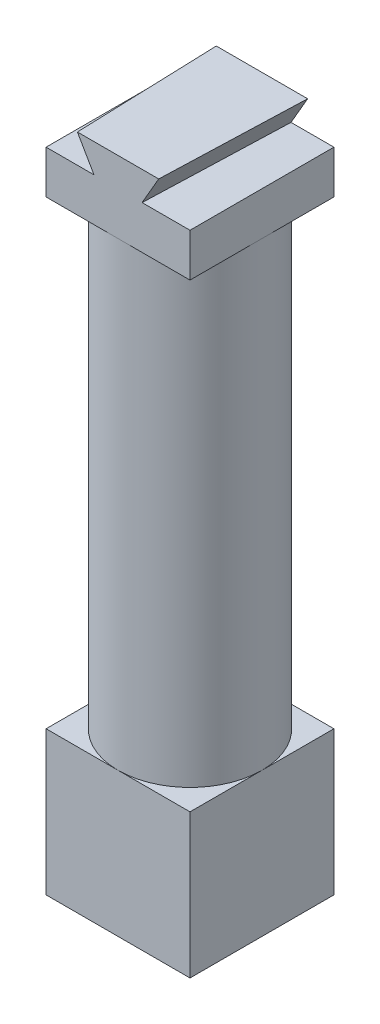
ISO-10303-21;
HEADER;
FILE_DESCRIPTION(('STEP AP214'),'2;1');
FILE_NAME('part.step','',(''),(''),'','','');
FILE_SCHEMA(('AUTOMOTIVE_DESIGN { 1 0 10303 214 1 1 1 1 }'));
ENDSEC;
DATA;
#1=APPLICATION_CONTEXT('core data for automotive mechanical design processes');
#2=APPLICATION_PROTOCOL_DEFINITION('international standard','automotive_design',2000,#1);
#3=PRODUCT_CONTEXT('',#1,'mechanical');
#4=PRODUCT('Part','Part','',(#3));
#5=PRODUCT_RELATED_PRODUCT_CATEGORY('part','',(#4));
#6=PRODUCT_DEFINITION_FORMATION('','',#4);
#7=PRODUCT_DEFINITION_CONTEXT('part definition',#1,'design');
#8=PRODUCT_DEFINITION('design','',#6,#7);
#9=PRODUCT_DEFINITION_SHAPE('','',#8);
#10=(LENGTH_UNIT() NAMED_UNIT(*) SI_UNIT(.MILLI.,.METRE.));
#11=(NAMED_UNIT(*) PLANE_ANGLE_UNIT() SI_UNIT($,.RADIAN.));
#12=(NAMED_UNIT(*) SI_UNIT($,.STERADIAN.) SOLID_ANGLE_UNIT());
#13=UNCERTAINTY_MEASURE_WITH_UNIT(LENGTH_MEASURE(1.E-05),#10,'distance_accuracy_value','');
#14=(GEOMETRIC_REPRESENTATION_CONTEXT(3) GLOBAL_UNCERTAINTY_ASSIGNED_CONTEXT((#13)) GLOBAL_UNIT_ASSIGNED_CONTEXT((#10,
#11,#12)) REPRESENTATION_CONTEXT('',''));
#15=CARTESIAN_POINT('',(0.,0.,0.));
#16=DIRECTION('',(0.,0.,1.));
#17=DIRECTION('',(1.,0.,0.));
#18=AXIS2_PLACEMENT_3D('',#15,#16,#17);
#19=CARTESIAN_POINT('',(3.20659618536911,-1.58749948953486,-7.9375));
#20=DIRECTION('',(0.,-1.,-2.4428830166427E-08));
#21=DIRECTION('',(0.,2.4428830166427E-08,-1.));
#22=AXIS2_PLACEMENT_3D('',#19,#20,#21);
#23=PLANE('',#22);
#24=DIRECTION('',(-0.0348995366665107,-2.44139487274035E-08,0.999390825623521));
#25=VECTOR('',#24,1.);
#26=CARTESIAN_POINT('',(3.20659618536911,-1.58749948953486,-7.9375));
#27=LINE('',#26,#25);
#28=CARTESIAN_POINT('',(3.20659618536911,-1.58749948953486,-7.9375));
#29=VERTEX_POINT('',#28);
#30=CARTESIAN_POINT('',(2.65222833409811,-1.58749987734253,7.9375));
#31=VERTEX_POINT('',#30);
#32=EDGE_CURVE('E136',#29,#31,#27,.T.);
#33=ORIENTED_EDGE('',*,*,#32,.T.);
#34=DIRECTION('',(1.,0.,0.));
#35=VECTOR('',#34,1.);
#36=CARTESIAN_POINT('',(-9.53384191881845E-07,-1.58749987734253,7.9375));
#37=LINE('',#36,#35);
#38=CARTESIAN_POINT('',(7.9374990466158,-1.58749987734253,7.9375));
#39=VERTEX_POINT('',#38);
#40=EDGE_CURVE('E139',#39,#31,#37,.F.);
#41=ORIENTED_EDGE('',*,*,#40,.F.);
#42=DIRECTION('',(-4.00371362729857E-08,0.,0.999999999999999));
#43=VECTOR('',#42,1.);
#44=CARTESIAN_POINT('',(7.93749968220534,-1.58749987734253,-7.9375));
#45=LINE('',#44,#43);
#46=CARTESIAN_POINT('',(7.93749968220534,-1.58749974807331,-7.9375));
#47=VERTEX_POINT('',#46);
#48=EDGE_CURVE('E578',#39,#47,#45,.F.);
#49=ORIENTED_EDGE('',*,*,#48,.T.);
#50=DIRECTION('',(1.,0.,0.));
#51=VECTOR('',#50,1.);
#52=CARTESIAN_POINT('',(-3.17794638038382E-07,-1.58749948953486,-7.9375));
#53=LINE('',#52,#51);
#54=EDGE_CURVE('E142',#47,#29,#53,.F.);
#55=ORIENTED_EDGE('',*,*,#54,.T.);
#56=EDGE_LOOP('',(#33,#41,#49,#55));
#57=FACE_BOUND('',#56,.T.);
#58=ADVANCED_FACE('F17',(#57),#23,.F.);
#59=CARTESIAN_POINT('',(5.03968329004614,1.58750051046514,-7.9375));
#60=DIRECTION('',(-0.865629643348206,0.499771507605598,-0.0302284756890831));
#61=DIRECTION('',(-0.499999999999993,-0.866025403784442,0.));
#62=AXIS2_PLACEMENT_3D('',#59,#60,#61);
#63=PLANE('',#62);
#64=DIRECTION('',(-0.0348995366665135,-2.44139501334482E-08,0.999390825623521));
#65=VECTOR('',#64,1.);
#66=CARTESIAN_POINT('',(5.03968329004614,1.58750051046514,-7.9375));
#67=LINE('',#66,#65);
#68=CARTESIAN_POINT('',(5.03968329004614,1.58750051046514,-7.9375));
#69=VERTEX_POINT('',#68);
#70=CARTESIAN_POINT('',(4.48531543877511,1.58750012265744,7.9375));
#71=VERTEX_POINT('',#70);
#72=EDGE_CURVE('E145',#69,#71,#67,.T.);
#73=ORIENTED_EDGE('',*,*,#72,.T.);
#74=DIRECTION('',(0.499999999999987,0.866025403784446,0.));
#75=VECTOR('',#74,1.);
#76=CARTESIAN_POINT('',(2.65222833409811,-1.58749987734253,7.9375));
#77=LINE('',#76,#75);
#78=EDGE_CURVE('E149',#31,#71,#77,.T.);
#79=ORIENTED_EDGE('',*,*,#78,.F.);
#80=ORIENTED_EDGE('',*,*,#32,.F.);
#81=DIRECTION('',(0.499999999999993,0.866025403784442,0.));
#82=VECTOR('',#81,1.);
#83=CARTESIAN_POINT('',(3.20659618536911,-1.58749948953486,-7.9375));
#84=LINE('',#83,#82);
#85=EDGE_CURVE('E190',#29,#69,#84,.T.);
#86=ORIENTED_EDGE('',*,*,#85,.T.);
#87=EDGE_LOOP('',(#73,#79,#80,#86));
#88=FACE_BOUND('',#87,.T.);
#89=ADVANCED_FACE('F150',(#88),#63,.F.);
#90=CARTESIAN_POINT('',(-5.03968392563541,1.58750051046514,-7.9375));
#91=DIRECTION('',(0.,-1.,-2.44288315575337E-08));
#92=DIRECTION('',(0.,2.44288315575337E-08,-1.));
#93=AXIS2_PLACEMENT_3D('',#90,#91,#92);
#94=PLANE('',#93);
#95=DIRECTION('',(0.0348994567384862,-2.44139502425854E-08,0.999390828414669));
#96=VECTOR('',#95,1.);
#97=CARTESIAN_POINT('',(-5.03968392563541,1.58750051046514,-7.9375));
#98=LINE('',#97,#96);
#99=CARTESIAN_POINT('',(-5.03968392563541,1.58750051046514,-7.9375));
#100=VERTEX_POINT('',#99);
#101=CARTESIAN_POINT('',(-4.48531734554349,1.58750012265744,7.9375));
#102=VERTEX_POINT('',#101);
#103=EDGE_CURVE('E195',#100,#102,#98,.T.);
#104=ORIENTED_EDGE('',*,*,#103,.T.);
#105=DIRECTION('',(1.,0.,0.));
#106=VECTOR('',#105,1.);
#107=CARTESIAN_POINT('',(-9.53384191881845E-07,1.58750012265744,7.9375));
#108=LINE('',#107,#106);
#109=EDGE_CURVE('E155',#71,#102,#108,.F.);
#110=ORIENTED_EDGE('',*,*,#109,.F.);
#111=ORIENTED_EDGE('',*,*,#72,.F.);
#112=DIRECTION('',(1.,0.,0.));
#113=VECTOR('',#112,1.);
#114=CARTESIAN_POINT('',(-3.17794638038382E-07,1.58750051046514,-7.9375));
#115=LINE('',#114,#113);
#116=EDGE_CURVE('E199',#69,#100,#115,.F.);
#117=ORIENTED_EDGE('',*,*,#116,.T.);
#118=EDGE_LOOP('',(#104,#110,#111,#117));
#119=FACE_BOUND('',#118,.T.);
#120=ADVANCED_FACE('F342',(#119),#94,.F.);
#121=CARTESIAN_POINT('',(-3.20659682095838,-1.58749948953486,-7.9375));
#122=DIRECTION('',(0.865629645161938,0.499771508652756,-0.0302284064377552));
#123=DIRECTION('',(-0.499999999999993,0.866025403784443,0.));
#124=AXIS2_PLACEMENT_3D('',#121,#122,#123);
#125=PLANE('',#124);
#126=DIRECTION('',(0.0348994567384834,-2.44139486590788E-08,0.999390828414669));
#127=VECTOR('',#126,1.);
#128=CARTESIAN_POINT('',(-3.20659682095838,-1.58749948953486,-7.9375));
#129=LINE('',#128,#127);
#130=CARTESIAN_POINT('',(-3.20659682095838,-1.58749948953486,-7.9375));
#131=VERTEX_POINT('',#130);
#132=CARTESIAN_POINT('',(-2.6522302408665,-1.58749987734254,7.9375));
#133=VERTEX_POINT('',#132);
#134=EDGE_CURVE('E191',#131,#133,#129,.T.);
#135=ORIENTED_EDGE('',*,*,#134,.T.);
#136=DIRECTION('',(0.499999999999987,-0.866025403784446,0.));
#137=VECTOR('',#136,1.);
#138=CARTESIAN_POINT('',(-4.48531734554349,1.58750012265744,7.9375));
#139=LINE('',#138,#137);
#140=EDGE_CURVE('E180',#102,#133,#139,.T.);
#141=ORIENTED_EDGE('',*,*,#140,.F.);
#142=ORIENTED_EDGE('',*,*,#103,.F.);
#143=DIRECTION('',(0.499999999999993,-0.866025403784442,0.));
#144=VECTOR('',#143,1.);
#145=CARTESIAN_POINT('',(-5.03968392563541,1.58750051046514,-7.9375));
#146=LINE('',#145,#144);
#147=EDGE_CURVE('E186',#100,#131,#146,.T.);
#148=ORIENTED_EDGE('',*,*,#147,.T.);
#149=EDGE_LOOP('',(#135,#141,#142,#148));
#150=FACE_BOUND('',#149,.T.);
#151=ADVANCED_FACE('F338',(#150),#125,.F.);
#152=CARTESIAN_POINT('',(-7.93750031779463,-1.58749948953488,-7.9375));
#153=DIRECTION('',(0.,-1.,-2.44288301531891E-08));
#154=DIRECTION('',(0.,2.44288301531891E-08,-1.));
#155=AXIS2_PLACEMENT_3D('',#152,#153,#154);
#156=PLANE('',#155);
#157=DIRECTION('',(4.00371376940711E-08,0.,-0.999999999999999));
#158=VECTOR('',#157,1.);
#159=CARTESIAN_POINT('',(-7.93750031779463,-1.58749948953488,-7.9375));
#160=LINE('',#159,#158);
#161=CARTESIAN_POINT('',(-7.93750031779463,-1.58749948953487,-7.9375));
#162=VERTEX_POINT('',#161);
#163=CARTESIAN_POINT('',(-7.9375009533842,-1.58749974807332,7.9375));
#164=VERTEX_POINT('',#163);
#165=EDGE_CURVE('E170',#162,#164,#160,.F.);
#166=ORIENTED_EDGE('',*,*,#165,.T.);
#167=DIRECTION('',(1.,0.,0.));
#168=VECTOR('',#167,1.);
#169=CARTESIAN_POINT('',(-9.53384191881845E-07,-1.58749987734253,7.9375));
#170=LINE('',#169,#168);
#171=EDGE_CURVE('E176',#133,#164,#170,.F.);
#172=ORIENTED_EDGE('',*,*,#171,.F.);
#173=ORIENTED_EDGE('',*,*,#134,.F.);
#174=DIRECTION('',(1.,0.,0.));
#175=VECTOR('',#174,1.);
#176=CARTESIAN_POINT('',(-3.17794638038382E-07,-1.58749948953486,-7.9375));
#177=LINE('',#176,#175);
#178=EDGE_CURVE('E183',#131,#162,#177,.F.);
#179=ORIENTED_EDGE('',*,*,#178,.T.);
#180=EDGE_LOOP('',(#166,#172,#173,#179));
#181=FACE_BOUND('',#180,.T.);
#182=ADVANCED_FACE('F334',(#181),#156,.F.);
#183=CARTESIAN_POINT('',(-3.17794638038382E-07,-2.63284705706569,-7.9375));
#184=DIRECTION('',(0.,0.,1.));
#185=DIRECTION('',(1.,0.,0.));
#186=AXIS2_PLACEMENT_3D('',#183,#184,#185);
#187=PLANE('',#186);
#188=ORIENTED_EDGE('',*,*,#178,.F.);
#189=ORIENTED_EDGE('',*,*,#147,.F.);
#190=ORIENTED_EDGE('',*,*,#116,.F.);
#191=ORIENTED_EDGE('',*,*,#85,.F.);
#192=ORIENTED_EDGE('',*,*,#54,.F.);
#193=DIRECTION('',(0.,1.,0.));
#194=VECTOR('',#193,1.);
#195=CARTESIAN_POINT('',(7.93749968220534,-1.58749948953486,-7.9375));
#196=LINE('',#195,#194);
#197=CARTESIAN_POINT('',(7.93749989406845,-6.3499994895349,-7.9375));
#198=VERTEX_POINT('',#197);
#199=EDGE_CURVE('E173',#47,#198,#196,.F.);
#200=ORIENTED_EDGE('',*,*,#199,.T.);
#201=DIRECTION('',(1.,0.,0.));
#202=VECTOR('',#201,1.);
#203=CARTESIAN_POINT('',(7.93749968220534,-6.3499994895349,-7.9375));
#204=LINE('',#203,#202);
#205=CARTESIAN_POINT('',(0.,-6.34999958648679,-7.9375));
#206=VERTEX_POINT('',#205);
#207=EDGE_CURVE('E613',#198,#206,#204,.F.);
#208=ORIENTED_EDGE('',*,*,#207,.T.);
#209=DIRECTION('',(1.,0.,0.));
#210=VECTOR('',#209,1.);
#211=CARTESIAN_POINT('',(7.93749968220534,-6.3499994895349,-7.9375));
#212=LINE('',#211,#210);
#213=CARTESIAN_POINT('',(-7.93750031779464,-6.34999948953491,-7.9375));
#214=VERTEX_POINT('',#213);
#215=EDGE_CURVE('E628',#206,#214,#212,.F.);
#216=ORIENTED_EDGE('',*,*,#215,.T.);
#217=DIRECTION('',(0.,1.,0.));
#218=VECTOR('',#217,1.);
#219=CARTESIAN_POINT('',(-7.93750031779463,-6.34999948953488,-7.9375));
#220=LINE('',#219,#218);
#221=EDGE_CURVE('E172',#214,#162,#220,.T.);
#222=ORIENTED_EDGE('',*,*,#221,.T.);
#223=EDGE_LOOP('',(#188,#189,#190,#191,#192,#200,#208,#216,#222));
#224=FACE_BOUND('',#223,.T.);
#225=ADVANCED_FACE('F330',(#224),#187,.F.);
#226=CARTESIAN_POINT('',(7.93750000000012,-73.025,-7.93750000000003));
#227=DIRECTION('',(0.,-1.,0.));
#228=DIRECTION('',(0.,0.,-1.));
#229=AXIS2_PLACEMENT_3D('',#226,#227,#228);
#230=PLANE('',#229);
#231=DIRECTION('',(-1.,0.,0.));
#232=VECTOR('',#231,1.);
#233=CARTESIAN_POINT('',(7.93750000000012,-73.025,-7.93750000000003));
#234=LINE('',#233,#232);
#235=CARTESIAN_POINT('',(7.93750000000012,-73.025,-7.93750000000003));
#236=VERTEX_POINT('',#235);
#237=CARTESIAN_POINT('',(-7.93749999999988,-73.025,-7.93750000000003));
#238=VERTEX_POINT('',#237);
#239=EDGE_CURVE('E185',#236,#238,#234,.T.);
#240=ORIENTED_EDGE('',*,*,#239,.F.);
#241=DIRECTION('',(0.,0.,1.));
#242=VECTOR('',#241,1.);
#243=CARTESIAN_POINT('',(7.93750000000012,-73.025,-7.93750000000003));
#244=LINE('',#243,#242);
#245=CARTESIAN_POINT('',(7.93750000000012,-73.025,7.93749999999997));
#246=VERTEX_POINT('',#245);
#247=EDGE_CURVE('E574',#246,#236,#244,.F.);
#248=ORIENTED_EDGE('',*,*,#247,.F.);
#249=DIRECTION('',(-1.,0.,0.));
#250=VECTOR('',#249,1.);
#251=CARTESIAN_POINT('',(7.93750000000012,-73.025,7.93749999999997));
#252=LINE('',#251,#250);
#253=CARTESIAN_POINT('',(-7.93749999999988,-73.025,7.93749999999996));
#254=VERTEX_POINT('',#253);
#255=EDGE_CURVE('E585',#246,#254,#252,.T.);
#256=ORIENTED_EDGE('',*,*,#255,.T.);
#257=DIRECTION('',(0.,0.,1.));
#258=VECTOR('',#257,1.);
#259=CARTESIAN_POINT('',(-7.93749999999988,-73.025,-7.93750000000003));
#260=LINE('',#259,#258);
#261=EDGE_CURVE('E588',#238,#254,#260,.T.);
#262=ORIENTED_EDGE('',*,*,#261,.F.);
#263=EDGE_LOOP('',(#240,#248,#256,#262));
#264=FACE_BOUND('',#263,.T.);
#265=ADVANCED_FACE('F326',(#264),#230,.T.);
#266=CARTESIAN_POINT('',(7.93750000000012,-57.15,-7.93750000000003));
#267=DIRECTION('',(0.,0.,-1.));
#268=DIRECTION('',(-1.,0.,0.));
#269=AXIS2_PLACEMENT_3D('',#266,#267,#268);
#270=PLANE('',#269);
#271=DIRECTION('',(1.,0.,0.));
#272=VECTOR('',#271,1.);
#273=CARTESIAN_POINT('',(-7.93749999999988,-57.15,-7.93750000000003));
#274=LINE('',#273,#272);
#275=CARTESIAN_POINT('',(7.93750000000008,-57.15,-7.93750000000003));
#276=VERTEX_POINT('',#275);
#277=CARTESIAN_POINT('',(0.,-57.15,-7.93750000000002));
#278=VERTEX_POINT('',#277);
#279=EDGE_CURVE('E179',#276,#278,#274,.F.);
#280=ORIENTED_EDGE('',*,*,#279,.F.);
#281=DIRECTION('',(0.,1.,0.));
#282=VECTOR('',#281,1.);
#283=CARTESIAN_POINT('',(7.93750000000012,-57.15,-7.93750000000003));
#284=LINE('',#283,#282);
#285=EDGE_CURVE('E570',#236,#276,#284,.T.);
#286=ORIENTED_EDGE('',*,*,#285,.F.);
#287=ORIENTED_EDGE('',*,*,#239,.T.);
#288=DIRECTION('',(0.,1.,0.));
#289=VECTOR('',#288,1.);
#290=CARTESIAN_POINT('',(-7.93749999999988,-73.025,-7.93750000000003));
#291=LINE('',#290,#289);
#292=CARTESIAN_POINT('',(-7.93749999999988,-57.15,-7.93750000000003));
#293=VERTEX_POINT('',#292);
#294=EDGE_CURVE('E593',#293,#238,#291,.F.);
#295=ORIENTED_EDGE('',*,*,#294,.F.);
#296=DIRECTION('',(1.,0.,0.));
#297=VECTOR('',#296,1.);
#298=CARTESIAN_POINT('',(-7.93749999999988,-57.15,-7.93750000000003));
#299=LINE('',#298,#297);
#300=EDGE_CURVE('E632',#278,#293,#299,.F.);
#301=ORIENTED_EDGE('',*,*,#300,.F.);
#302=EDGE_LOOP('',(#280,#286,#287,#295,#301));
#303=FACE_BOUND('',#302,.T.);
#304=ADVANCED_FACE('F322',(#303),#270,.T.);
#305=CARTESIAN_POINT('',(7.93749968220534,-1.58749948953486,-7.9375));
#306=DIRECTION('',(-0.999999999999999,0.,-4.00371362729857E-08));
#307=DIRECTION('',(-4.00371362729857E-08,0.,0.999999999999999));
#308=AXIS2_PLACEMENT_3D('',#305,#306,#307);
#309=PLANE('',#308);
#310=ORIENTED_EDGE('',*,*,#48,.F.);
#311=DIRECTION('',(0.,1.,0.));
#312=VECTOR('',#311,1.);
#313=CARTESIAN_POINT('',(7.9374990466158,-2.70018998546747,7.9375));
#314=LINE('',#313,#312);
#315=CARTESIAN_POINT('',(7.9374990466158,-6.34999987734253,7.93750000000001));
#316=VERTEX_POINT('',#315);
#317=EDGE_CURVE('E160',#316,#39,#314,.T.);
#318=ORIENTED_EDGE('',*,*,#317,.F.);
#319=DIRECTION('',(0.,-2.44288273165693E-08,1.));
#320=VECTOR('',#319,1.);
#321=CARTESIAN_POINT('',(7.9374990466158,-6.3499994895349,-7.9375));
#322=LINE('',#321,#320);
#323=CARTESIAN_POINT('',(7.9374995233079,-6.34999974476744,0.));
#324=VERTEX_POINT('',#323);
#325=EDGE_CURVE('E611',#316,#324,#322,.F.);
#326=ORIENTED_EDGE('',*,*,#325,.T.);
#327=DIRECTION('',(0.,-2.44288273165693E-08,1.));
#328=VECTOR('',#327,1.);
#329=CARTESIAN_POINT('',(7.9375,-6.3499994895349,-7.9375));
#330=LINE('',#329,#328);
#331=EDGE_CURVE('E608',#324,#198,#330,.F.);
#332=ORIENTED_EDGE('',*,*,#331,.T.);
#333=ORIENTED_EDGE('',*,*,#199,.F.);
#334=EDGE_LOOP('',(#310,#318,#326,#332,#333));
#335=FACE_BOUND('',#334,.T.);
#336=ADVANCED_FACE('F318',(#335),#309,.F.);
#337=CARTESIAN_POINT('',(-7.93750031779463,-6.34999948953488,-7.9375));
#338=DIRECTION('',(0.999999999999999,0.,4.00371376940711E-08));
#339=DIRECTION('',(4.00371376940711E-08,0.,-0.999999999999999));
#340=AXIS2_PLACEMENT_3D('',#337,#338,#339);
#341=PLANE('',#340);
#342=DIRECTION('',(0.,-2.44288273165693E-08,1.));
#343=VECTOR('',#342,1.);
#344=CARTESIAN_POINT('',(-7.93750031779464,-6.34999948953491,-7.9375));
#345=LINE('',#344,#343);
#346=CARTESIAN_POINT('',(-7.9375003177947,-6.34999978039062,-1.5889739090428E-07));
#347=VERTEX_POINT('',#346);
#348=EDGE_CURVE('E614',#214,#347,#345,.T.);
#349=ORIENTED_EDGE('',*,*,#348,.T.);
#350=DIRECTION('',(0.,-2.44288273165693E-08,1.));
#351=VECTOR('',#350,1.);
#352=CARTESIAN_POINT('',(-7.93750063558941,-6.34999948953491,-7.9375));
#353=LINE('',#352,#351);
#354=CARTESIAN_POINT('',(-7.93750074152101,-6.34999987734255,7.9375));
#355=VERTEX_POINT('',#354);
#356=EDGE_CURVE('E559',#347,#355,#353,.T.);
#357=ORIENTED_EDGE('',*,*,#356,.T.);
#358=DIRECTION('',(0.,1.,0.));
#359=VECTOR('',#358,1.);
#360=CARTESIAN_POINT('',(-7.9375009533842,-2.70018998546747,7.9375));
#361=LINE('',#360,#359);
#362=EDGE_CURVE('E162',#164,#355,#361,.F.);
#363=ORIENTED_EDGE('',*,*,#362,.F.);
#364=ORIENTED_EDGE('',*,*,#165,.F.);
#365=ORIENTED_EDGE('',*,*,#221,.F.);
#366=EDGE_LOOP('',(#349,#357,#363,#364,#365));
#367=FACE_BOUND('',#366,.T.);
#368=ADVANCED_FACE('F315',(#367),#341,.F.);
#369=CARTESIAN_POINT('',(-9.53384191881845E-07,-2.70018998546747,7.9375));
#370=DIRECTION('',(0.,0.,1.));
#371=DIRECTION('',(1.,0.,0.));
#372=AXIS2_PLACEMENT_3D('',#369,#370,#371);
#373=PLANE('',#372);
#374=ORIENTED_EDGE('',*,*,#140,.T.);
#375=ORIENTED_EDGE('',*,*,#171,.T.);
#376=ORIENTED_EDGE('',*,*,#362,.T.);
#377=DIRECTION('',(1.,0.,0.));
#378=VECTOR('',#377,1.);
#379=CARTESIAN_POINT('',(7.93749968220534,-6.34999987734253,7.9375));
#380=LINE('',#379,#378);
#381=CARTESIAN_POINT('',(0.,-6.34999993867127,7.9375));
#382=VERTEX_POINT('',#381);
#383=EDGE_CURVE('E243',#355,#382,#380,.T.);
#384=ORIENTED_EDGE('',*,*,#383,.T.);
#385=DIRECTION('',(1.,0.,0.));
#386=VECTOR('',#385,1.);
#387=CARTESIAN_POINT('',(7.93749968220534,-6.34999987734253,7.9375));
#388=LINE('',#387,#386);
#389=EDGE_CURVE('E668',#382,#316,#388,.T.);
#390=ORIENTED_EDGE('',*,*,#389,.T.);
#391=ORIENTED_EDGE('',*,*,#317,.T.);
#392=ORIENTED_EDGE('',*,*,#40,.T.);
#393=ORIENTED_EDGE('',*,*,#78,.T.);
#394=ORIENTED_EDGE('',*,*,#109,.T.);
#395=EDGE_LOOP('',(#374,#375,#376,#384,#390,#391,#392,#393,#394));
#396=FACE_BOUND('',#395,.T.);
#397=ADVANCED_FACE('F158',(#396),#373,.T.);
#398=CARTESIAN_POINT('',(-7.93749999999988,-57.15,-7.93750000000003));
#399=DIRECTION('',(0.,1.,0.));
#400=DIRECTION('',(0.,0.,1.));
#401=AXIS2_PLACEMENT_3D('',#398,#399,#400);
#402=PLANE('',#401);
#403=DIRECTION('',(0.,0.,1.));
#404=VECTOR('',#403,1.);
#405=CARTESIAN_POINT('',(7.93750000000012,-57.15,-7.93750000000003));
#406=LINE('',#405,#404);
#407=CARTESIAN_POINT('',(7.93750000000006,-57.15,0.));
#408=VERTEX_POINT('',#407);
#409=EDGE_CURVE('E573',#276,#408,#406,.T.);
#410=ORIENTED_EDGE('',*,*,#409,.F.);
#411=ORIENTED_EDGE('',*,*,#279,.T.);
#412=CARTESIAN_POINT('',(0.,-57.15,0.));
#413=DIRECTION('',(0.,-1.,0.));
#414=DIRECTION('',(0.,0.,-1.));
#415=AXIS2_PLACEMENT_3D('',#412,#413,#414);
#416=CIRCLE('',#415,7.9375);
#417=EDGE_CURVE('E62',#408,#278,#416,.F.);
#418=ORIENTED_EDGE('',*,*,#417,.F.);
#419=EDGE_LOOP('',(#410,#411,#418));
#420=FACE_BOUND('',#419,.T.);
#421=ADVANCED_FACE('F309',(#420),#402,.T.);
#422=CARTESIAN_POINT('',(-7.93749999999988,-57.15,-7.93750000000003));
#423=DIRECTION('',(0.,1.,0.));
#424=DIRECTION('',(0.,0.,1.));
#425=AXIS2_PLACEMENT_3D('',#422,#423,#424);
#426=PLANE('',#425);
#427=ORIENTED_EDGE('',*,*,#300,.T.);
#428=DIRECTION('',(0.,0.,1.));
#429=VECTOR('',#428,1.);
#430=CARTESIAN_POINT('',(-7.93749999999988,-57.15,-7.93750000000003));
#431=LINE('',#430,#429);
#432=CARTESIAN_POINT('',(-7.93749999999997,-57.15,-1.58897390175465E-07));
#433=VERTEX_POINT('',#432);
#434=EDGE_CURVE('E598',#433,#293,#431,.F.);
#435=ORIENTED_EDGE('',*,*,#434,.F.);
#436=CARTESIAN_POINT('',(0.,-57.15,0.));
#437=DIRECTION('',(0.,-1.,0.));
#438=DIRECTION('',(0.,0.,-1.));
#439=AXIS2_PLACEMENT_3D('',#436,#437,#438);
#440=CIRCLE('',#439,7.9375);
#441=EDGE_CURVE('E240',#278,#433,#440,.F.);
#442=ORIENTED_EDGE('',*,*,#441,.F.);
#443=EDGE_LOOP('',(#427,#435,#442));
#444=FACE_BOUND('',#443,.T.);
#445=ADVANCED_FACE('F305',(#444),#426,.T.);
#446=CARTESIAN_POINT('',(7.93749968220534,-6.3499994895349,-7.9375));
#447=DIRECTION('',(0.,1.,2.44288273165693E-08));
#448=DIRECTION('',(0.,-2.44288273165693E-08,1.));
#449=AXIS2_PLACEMENT_3D('',#446,#447,#448);
#450=PLANE('',#449);
#451=ORIENTED_EDGE('',*,*,#348,.F.);
#452=ORIENTED_EDGE('',*,*,#215,.F.);
#453=CARTESIAN_POINT('',(0.,-6.3499996834387,0.));
#454=DIRECTION('',(0.,-1.,0.));
#455=DIRECTION('',(0.,0.,-1.));
#456=AXIS2_PLACEMENT_3D('',#453,#454,#455);
#457=CIRCLE('',#456,7.9375);
#458=EDGE_CURVE('E237',#347,#206,#457,.T.);
#459=ORIENTED_EDGE('',*,*,#458,.F.);
#460=EDGE_LOOP('',(#451,#452,#459));
#461=FACE_BOUND('',#460,.T.);
#462=ADVANCED_FACE('F301',(#461),#450,.F.);
#463=CARTESIAN_POINT('',(7.93749968220534,-6.3499994895349,-7.9375));
#464=DIRECTION('',(0.,1.,2.44288273165693E-08));
#465=DIRECTION('',(0.,-2.44288273165693E-08,1.));
#466=AXIS2_PLACEMENT_3D('',#463,#464,#465);
#467=PLANE('',#466);
#468=ORIENTED_EDGE('',*,*,#207,.F.);
#469=ORIENTED_EDGE('',*,*,#331,.F.);
#470=CARTESIAN_POINT('',(0.,-6.34999948953489,0.));
#471=DIRECTION('',(0.,-1.,0.));
#472=DIRECTION('',(0.,0.,-1.));
#473=AXIS2_PLACEMENT_3D('',#470,#471,#472);
#474=CIRCLE('',#473,7.9375);
#475=EDGE_CURVE('E233',#206,#324,#474,.T.);
#476=ORIENTED_EDGE('',*,*,#475,.F.);
#477=EDGE_LOOP('',(#468,#469,#476));
#478=FACE_BOUND('',#477,.T.);
#479=ADVANCED_FACE('F297',(#478),#467,.F.);
#480=CARTESIAN_POINT('',(-7.93749999999988,-73.025,-7.93750000000003));
#481=DIRECTION('',(-1.,0.,0.));
#482=DIRECTION('',(0.,0.,1.));
#483=AXIS2_PLACEMENT_3D('',#480,#481,#482);
#484=PLANE('',#483);
#485=ORIENTED_EDGE('',*,*,#294,.T.);
#486=ORIENTED_EDGE('',*,*,#261,.T.);
#487=DIRECTION('',(0.,1.,0.));
#488=VECTOR('',#487,1.);
#489=CARTESIAN_POINT('',(-7.93749999999988,-57.15,7.93749999999996));
#490=LINE('',#489,#488);
#491=CARTESIAN_POINT('',(-7.93749999999988,-57.15,7.93749999999996));
#492=VERTEX_POINT('',#491);
#493=EDGE_CURVE('E587',#254,#492,#490,.T.);
#494=ORIENTED_EDGE('',*,*,#493,.T.);
#495=DIRECTION('',(0.,0.,1.));
#496=VECTOR('',#495,1.);
#497=CARTESIAN_POINT('',(-7.93749999999988,-57.15,-7.93750000000003));
#498=LINE('',#497,#496);
#499=EDGE_CURVE('E236',#433,#492,#498,.T.);
#500=ORIENTED_EDGE('',*,*,#499,.F.);
#501=ORIENTED_EDGE('',*,*,#434,.T.);
#502=EDGE_LOOP('',(#485,#486,#494,#500,#501));
#503=FACE_BOUND('',#502,.T.);
#504=ADVANCED_FACE('F294',(#503),#484,.T.);
#505=CARTESIAN_POINT('',(7.93750000000012,-57.15,7.93749999999997));
#506=DIRECTION('',(0.,0.,-1.));
#507=DIRECTION('',(-1.,0.,0.));
#508=AXIS2_PLACEMENT_3D('',#505,#506,#507);
#509=PLANE('',#508);
#510=ORIENTED_EDGE('',*,*,#255,.F.);
#511=DIRECTION('',(0.,1.,0.));
#512=VECTOR('',#511,1.);
#513=CARTESIAN_POINT('',(7.93750000000012,-57.15,7.93749999999997));
#514=LINE('',#513,#512);
#515=CARTESIAN_POINT('',(7.93750000000012,-57.15,7.93749999999997));
#516=VERTEX_POINT('',#515);
#517=EDGE_CURVE('E67',#516,#246,#514,.F.);
#518=ORIENTED_EDGE('',*,*,#517,.F.);
#519=DIRECTION('',(1.,0.,0.));
#520=VECTOR('',#519,1.);
#521=CARTESIAN_POINT('',(-7.93749999999988,-57.15,7.93749999999997));
#522=LINE('',#521,#520);
#523=CARTESIAN_POINT('',(0.,-57.15,7.93749999999998));
#524=VERTEX_POINT('',#523);
#525=EDGE_CURVE('E35',#524,#516,#522,.T.);
#526=ORIENTED_EDGE('',*,*,#525,.F.);
#527=DIRECTION('',(1.,0.,0.));
#528=VECTOR('',#527,1.);
#529=CARTESIAN_POINT('',(-7.93749999999988,-57.15,7.93749999999996));
#530=LINE('',#529,#528);
#531=EDGE_CURVE('E647',#492,#524,#530,.T.);
#532=ORIENTED_EDGE('',*,*,#531,.F.);
#533=ORIENTED_EDGE('',*,*,#493,.F.);
#534=EDGE_LOOP('',(#510,#518,#526,#532,#533));
#535=FACE_BOUND('',#534,.T.);
#536=ADVANCED_FACE('F290',(#535),#509,.F.);
#537=CARTESIAN_POINT('',(7.93750000000012,-57.15,-7.93750000000003));
#538=DIRECTION('',(1.,0.,0.));
#539=DIRECTION('',(0.,1.,0.));
#540=AXIS2_PLACEMENT_3D('',#537,#538,#539);
#541=PLANE('',#540);
#542=ORIENTED_EDGE('',*,*,#409,.T.);
#543=DIRECTION('',(0.,0.,1.));
#544=VECTOR('',#543,1.);
#545=CARTESIAN_POINT('',(7.93750000000012,-57.15,-7.93750000000003));
#546=LINE('',#545,#544);
#547=EDGE_CURVE('E232',#516,#408,#546,.F.);
#548=ORIENTED_EDGE('',*,*,#547,.F.);
#549=ORIENTED_EDGE('',*,*,#517,.T.);
#550=ORIENTED_EDGE('',*,*,#247,.T.);
#551=ORIENTED_EDGE('',*,*,#285,.T.);
#552=EDGE_LOOP('',(#542,#548,#549,#550,#551));
#553=FACE_BOUND('',#552,.T.);
#554=ADVANCED_FACE('F286',(#553),#541,.T.);
#555=CARTESIAN_POINT('',(7.93749968220534,-6.3499994895349,-7.9375));
#556=DIRECTION('',(0.,1.,2.44288273165693E-08));
#557=DIRECTION('',(0.,-2.44288273165693E-08,1.));
#558=AXIS2_PLACEMENT_3D('',#555,#556,#557);
#559=PLANE('',#558);
#560=ORIENTED_EDGE('',*,*,#325,.F.);
#561=ORIENTED_EDGE('',*,*,#389,.F.);
#562=CARTESIAN_POINT('',(0.,-6.35,0.));
#563=DIRECTION('',(0.,-1.,0.));
#564=DIRECTION('',(0.,0.,-1.));
#565=AXIS2_PLACEMENT_3D('',#562,#563,#564);
#566=CIRCLE('',#565,7.9375);
#567=EDGE_CURVE('E229',#324,#382,#566,.T.);
#568=ORIENTED_EDGE('',*,*,#567,.F.);
#569=EDGE_LOOP('',(#560,#561,#568));
#570=FACE_BOUND('',#569,.T.);
#571=ADVANCED_FACE('F282',(#570),#559,.F.);
#572=CARTESIAN_POINT('',(7.93749968220534,-6.3499994895349,-7.9375));
#573=DIRECTION('',(0.,1.,2.44288273165693E-08));
#574=DIRECTION('',(0.,-2.44288273165693E-08,1.));
#575=AXIS2_PLACEMENT_3D('',#572,#573,#574);
#576=PLANE('',#575);
#577=ORIENTED_EDGE('',*,*,#383,.F.);
#578=ORIENTED_EDGE('',*,*,#356,.F.);
#579=CARTESIAN_POINT('',(0.,-6.34999987734254,0.));
#580=DIRECTION('',(0.,-1.,0.));
#581=DIRECTION('',(0.,0.,-1.));
#582=AXIS2_PLACEMENT_3D('',#579,#580,#581);
#583=CIRCLE('',#582,7.9375);
#584=EDGE_CURVE('E226',#382,#347,#583,.T.);
#585=ORIENTED_EDGE('',*,*,#584,.F.);
#586=EDGE_LOOP('',(#577,#578,#585));
#587=FACE_BOUND('',#586,.T.);
#588=ADVANCED_FACE('F278',(#587),#576,.F.);
#589=CARTESIAN_POINT('',(-7.93749999999988,-57.15,-7.93750000000003));
#590=DIRECTION('',(0.,1.,0.));
#591=DIRECTION('',(0.,0.,1.));
#592=AXIS2_PLACEMENT_3D('',#589,#590,#591);
#593=PLANE('',#592);
#594=ORIENTED_EDGE('',*,*,#499,.T.);
#595=ORIENTED_EDGE('',*,*,#531,.T.);
#596=CARTESIAN_POINT('',(0.,-57.15,0.));
#597=DIRECTION('',(0.,-1.,0.));
#598=DIRECTION('',(0.,0.,-1.));
#599=AXIS2_PLACEMENT_3D('',#596,#597,#598);
#600=CIRCLE('',#599,7.9375);
#601=EDGE_CURVE('E26',#433,#524,#600,.F.);
#602=ORIENTED_EDGE('',*,*,#601,.F.);
#603=EDGE_LOOP('',(#594,#595,#602));
#604=FACE_BOUND('',#603,.T.);
#605=ADVANCED_FACE('F274',(#604),#593,.T.);
#606=CARTESIAN_POINT('',(-7.93749999999988,-57.15,-7.93750000000003));
#607=DIRECTION('',(0.,1.,0.));
#608=DIRECTION('',(0.,0.,1.));
#609=AXIS2_PLACEMENT_3D('',#606,#607,#608);
#610=PLANE('',#609);
#611=ORIENTED_EDGE('',*,*,#525,.T.);
#612=ORIENTED_EDGE('',*,*,#547,.T.);
#613=CARTESIAN_POINT('',(0.,-57.15,0.));
#614=DIRECTION('',(0.,-1.,0.));
#615=DIRECTION('',(0.,0.,-1.));
#616=AXIS2_PLACEMENT_3D('',#613,#614,#615);
#617=CIRCLE('',#616,7.9375);
#618=EDGE_CURVE('E10',#524,#408,#617,.F.);
#619=ORIENTED_EDGE('',*,*,#618,.F.);
#620=EDGE_LOOP('',(#611,#612,#619));
#621=FACE_BOUND('',#620,.T.);
#622=ADVANCED_FACE('F270',(#621),#610,.T.);
#623=CARTESIAN_POINT('',(0.,-6.35,0.));
#624=DIRECTION('',(0.,-1.,0.));
#625=DIRECTION('',(0.,0.,-1.));
#626=AXIS2_PLACEMENT_3D('',#623,#624,#625);
#627=CYLINDRICAL_SURFACE('',#626,7.9375);
#628=ORIENTED_EDGE('',*,*,#475,.T.);
#629=ORIENTED_EDGE('',*,*,#567,.T.);
#630=ORIENTED_EDGE('',*,*,#584,.T.);
#631=ORIENTED_EDGE('',*,*,#458,.T.);
#632=EDGE_LOOP('',(#628,#629,#630,#631));
#633=FACE_BOUND('',#632,.T.);
#634=ORIENTED_EDGE('',*,*,#601,.T.);
#635=ORIENTED_EDGE('',*,*,#618,.T.);
#636=ORIENTED_EDGE('',*,*,#417,.T.);
#637=ORIENTED_EDGE('',*,*,#441,.T.);
#638=EDGE_LOOP('',(#634,#635,#636,#637));
#639=FACE_BOUND('',#638,.T.);
#640=ADVANCED_FACE('F267',(#633,#639),#627,.T.);
#641=CLOSED_SHELL('',(#58,#89,#120,#151,#182,#225,#265,#304,#336,#368,#397,#421,#445,#462,#479,
#504,#536,#554,#571,#588,#605,#622,#640));
#642=CARTESIAN_POINT('',(7.93749968220534,-6.3499994895349,-7.9375));
#643=DIRECTION('',(0.,1.,2.44288273165693E-08));
#644=DIRECTION('',(0.,-2.44288273165693E-08,1.));
#645=AXIS2_PLACEMENT_3D('',#642,#643,#644);
#646=PLANE('',#645);
#647=CARTESIAN_POINT('',(0.,-6.35,0.));
#648=DIRECTION('',(0.,-1.,0.));
#649=DIRECTION('',(0.,0.,-1.));
#650=AXIS2_PLACEMENT_3D('',#647,#648,#649);
#651=CIRCLE('',#650,7.2263);
#652=CARTESIAN_POINT('',(0.,-6.35,-7.2263));
#653=VERTEX_POINT('',#652);
#654=EDGE_CURVE('E20',#653,#653,#651,.T.);
#655=ORIENTED_EDGE('',*,*,#654,.T.);
#656=EDGE_LOOP('',(#655));
#657=FACE_BOUND('',#656,.T.);
#658=ADVANCED_FACE('F250',(#657),#646,.F.);
#659=CARTESIAN_POINT('',(-7.93749999999988,-57.15,-7.93750000000003));
#660=DIRECTION('',(0.,1.,0.));
#661=DIRECTION('',(0.,0.,1.));
#662=AXIS2_PLACEMENT_3D('',#659,#660,#661);
#663=PLANE('',#662);
#664=CARTESIAN_POINT('',(0.,-57.15,0.));
#665=DIRECTION('',(0.,-1.,0.));
#666=DIRECTION('',(0.,0.,-1.));
#667=AXIS2_PLACEMENT_3D('',#664,#665,#666);
#668=CIRCLE('',#667,7.2263);
#669=CARTESIAN_POINT('',(0.,-57.15,-7.2263));
#670=VERTEX_POINT('',#669);
#671=EDGE_CURVE('E146',#670,#670,#668,.F.);
#672=ORIENTED_EDGE('',*,*,#671,.T.);
#673=EDGE_LOOP('',(#672));
#674=FACE_BOUND('',#673,.T.);
#675=ADVANCED_FACE('F254',(#674),#663,.T.);
#676=CARTESIAN_POINT('',(0.,-6.35,0.));
#677=DIRECTION('',(0.,-1.,0.));
#678=DIRECTION('',(0.,0.,-1.));
#679=AXIS2_PLACEMENT_3D('',#676,#677,#678);
#680=CYLINDRICAL_SURFACE('',#679,7.2263);
#681=ORIENTED_EDGE('',*,*,#671,.F.);
#682=EDGE_LOOP('',(#681));
#683=FACE_BOUND('',#682,.T.);
#684=ORIENTED_EDGE('',*,*,#654,.F.);
#685=EDGE_LOOP('',(#684));
#686=FACE_BOUND('',#685,.T.);
#687=ADVANCED_FACE('F252',(#683,#686),#680,.F.);
#688=CLOSED_SHELL('',(#658,#675,#687));
#689=ORIENTED_CLOSED_SHELL('',*,#688,.T.);
#690=BREP_WITH_VOIDS('B1',#641,(#689));
#691=ADVANCED_BREP_SHAPE_REPRESENTATION('',(#18,#690),#14);
#692=SHAPE_DEFINITION_REPRESENTATION(#9,#691);
ENDSEC;
END-ISO-10303-21;
